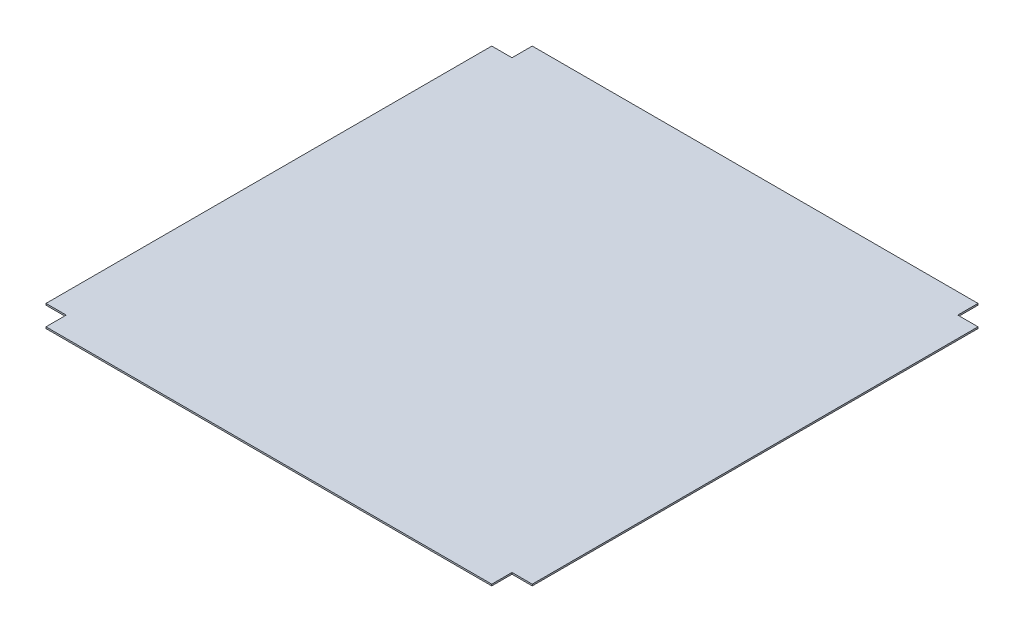
ISO-10303-21;
HEADER;
FILE_DESCRIPTION(('STEP AP214'),'2;1');
FILE_NAME('part.step','',(''),(''),'','','');
FILE_SCHEMA(('AUTOMOTIVE_DESIGN { 1 0 10303 214 1 1 1 1 }'));
ENDSEC;
DATA;
#1=APPLICATION_CONTEXT('core data for automotive mechanical design processes');
#2=APPLICATION_PROTOCOL_DEFINITION('international standard','automotive_design',2000,#1);
#3=PRODUCT_CONTEXT('',#1,'mechanical');
#4=PRODUCT('Part','Part','',(#3));
#5=PRODUCT_RELATED_PRODUCT_CATEGORY('part','',(#4));
#6=PRODUCT_DEFINITION_FORMATION('','',#4);
#7=PRODUCT_DEFINITION_CONTEXT('part definition',#1,'design');
#8=PRODUCT_DEFINITION('design','',#6,#7);
#9=PRODUCT_DEFINITION_SHAPE('','',#8);
#10=(LENGTH_UNIT() NAMED_UNIT(*) SI_UNIT(.MILLI.,.METRE.));
#11=(NAMED_UNIT(*) PLANE_ANGLE_UNIT() SI_UNIT($,.RADIAN.));
#12=(NAMED_UNIT(*) SI_UNIT($,.STERADIAN.) SOLID_ANGLE_UNIT());
#13=UNCERTAINTY_MEASURE_WITH_UNIT(LENGTH_MEASURE(1.E-05),#10,'distance_accuracy_value','');
#14=(GEOMETRIC_REPRESENTATION_CONTEXT(3) GLOBAL_UNCERTAINTY_ASSIGNED_CONTEXT((#13)) GLOBAL_UNIT_ASSIGNED_CONTEXT((#10,
#11,#12)) REPRESENTATION_CONTEXT('',''));
#15=CARTESIAN_POINT('',(0.,0.,0.));
#16=DIRECTION('',(0.,0.,1.));
#17=DIRECTION('',(1.,0.,0.));
#18=AXIS2_PLACEMENT_3D('',#15,#16,#17);
#19=CARTESIAN_POINT('',(609.6,2.,609.6));
#20=DIRECTION('',(-1.,0.,0.));
#21=DIRECTION('',(0.,0.,1.));
#22=AXIS2_PLACEMENT_3D('',#19,#20,#21);
#23=PLANE('',#22);
#24=DIRECTION('',(0.,0.,-1.));
#25=VECTOR('',#24,1.);
#26=CARTESIAN_POINT('',(609.6,2.,609.6));
#27=LINE('',#26,#25);
#28=CARTESIAN_POINT('',(609.600000000001,2.,558.8));
#29=VERTEX_POINT('',#28);
#30=CARTESIAN_POINT('',(609.6,2.,-558.8));
#31=VERTEX_POINT('',#30);
#32=EDGE_CURVE('E156',#29,#31,#27,.T.);
#33=ORIENTED_EDGE('',*,*,#32,.F.);
#34=DIRECTION('',(0.,1.,0.));
#35=VECTOR('',#34,1.);
#36=CARTESIAN_POINT('',(609.600000000001,-2.,558.8));
#37=LINE('',#36,#35);
#38=CARTESIAN_POINT('',(609.600000000001,-2.,558.8));
#39=VERTEX_POINT('',#38);
#40=EDGE_CURVE('E258',#39,#29,#37,.T.);
#41=ORIENTED_EDGE('',*,*,#40,.F.);
#42=DIRECTION('',(0.,0.,-1.));
#43=VECTOR('',#42,1.);
#44=CARTESIAN_POINT('',(609.6,-2.,609.6));
#45=LINE('',#44,#43);
#46=CARTESIAN_POINT('',(609.6,-2.,-558.8));
#47=VERTEX_POINT('',#46);
#48=EDGE_CURVE('E158',#39,#47,#45,.T.);
#49=ORIENTED_EDGE('',*,*,#48,.T.);
#50=DIRECTION('',(0.,1.,0.));
#51=VECTOR('',#50,1.);
#52=CARTESIAN_POINT('',(609.6,-2.,-558.8));
#53=LINE('',#52,#51);
#54=EDGE_CURVE('E140',#47,#31,#53,.T.);
#55=ORIENTED_EDGE('',*,*,#54,.T.);
#56=EDGE_LOOP('',(#33,#41,#49,#55));
#57=FACE_BOUND('',#56,.T.);
#58=ADVANCED_FACE('F47',(#57),#23,.F.);
#59=CARTESIAN_POINT('',(-609.6,2.,-609.6));
#60=DIRECTION('',(0.,0.,1.));
#61=DIRECTION('',(1.,0.,0.));
#62=AXIS2_PLACEMENT_3D('',#59,#60,#61);
#63=PLANE('',#62);
#64=DIRECTION('',(-1.,0.,0.));
#65=VECTOR('',#64,1.);
#66=CARTESIAN_POINT('',(-609.6,2.,-609.6));
#67=LINE('',#66,#65);
#68=CARTESIAN_POINT('',(558.800000000001,2.,-609.6));
#69=VERTEX_POINT('',#68);
#70=CARTESIAN_POINT('',(-558.800000000001,2.,-609.6));
#71=VERTEX_POINT('',#70);
#72=EDGE_CURVE('E168',#69,#71,#67,.T.);
#73=ORIENTED_EDGE('',*,*,#72,.F.);
#74=DIRECTION('',(0.,1.,0.));
#75=VECTOR('',#74,1.);
#76=CARTESIAN_POINT('',(558.800000000001,-2.,-609.6));
#77=LINE('',#76,#75);
#78=CARTESIAN_POINT('',(558.800000000001,-2.,-609.6));
#79=VERTEX_POINT('',#78);
#80=EDGE_CURVE('E248',#79,#69,#77,.T.);
#81=ORIENTED_EDGE('',*,*,#80,.F.);
#82=DIRECTION('',(-1.,0.,0.));
#83=VECTOR('',#82,1.);
#84=CARTESIAN_POINT('',(-609.6,-2.,-609.6));
#85=LINE('',#84,#83);
#86=CARTESIAN_POINT('',(-558.800000000001,-2.,-609.6));
#87=VERTEX_POINT('',#86);
#88=EDGE_CURVE('E184',#79,#87,#85,.T.);
#89=ORIENTED_EDGE('',*,*,#88,.T.);
#90=DIRECTION('',(0.,1.,0.));
#91=VECTOR('',#90,1.);
#92=CARTESIAN_POINT('',(-558.800000000001,-2.,-609.6));
#93=LINE('',#92,#91);
#94=EDGE_CURVE('E185',#87,#71,#93,.T.);
#95=ORIENTED_EDGE('',*,*,#94,.T.);
#96=EDGE_LOOP('',(#73,#81,#89,#95));
#97=FACE_BOUND('',#96,.T.);
#98=ADVANCED_FACE('F245',(#97),#63,.F.);
#99=CARTESIAN_POINT('',(-609.6,2.,609.6));
#100=DIRECTION('',(1.,0.,0.));
#101=DIRECTION('',(0.,0.,-1.));
#102=AXIS2_PLACEMENT_3D('',#99,#100,#101);
#103=PLANE('',#102);
#104=DIRECTION('',(0.,0.,1.));
#105=VECTOR('',#104,1.);
#106=CARTESIAN_POINT('',(-609.6,-2.,609.6));
#107=LINE('',#106,#105);
#108=CARTESIAN_POINT('',(-609.6,-2.,-558.8));
#109=VERTEX_POINT('',#108);
#110=CARTESIAN_POINT('',(-609.6,-2.,558.8));
#111=VERTEX_POINT('',#110);
#112=EDGE_CURVE('E175',#109,#111,#107,.T.);
#113=ORIENTED_EDGE('',*,*,#112,.T.);
#114=DIRECTION('',(0.,1.,0.));
#115=VECTOR('',#114,1.);
#116=CARTESIAN_POINT('',(-609.6,-2.,558.8));
#117=LINE('',#116,#115);
#118=CARTESIAN_POINT('',(-609.6,2.,558.8));
#119=VERTEX_POINT('',#118);
#120=EDGE_CURVE('E196',#111,#119,#117,.T.);
#121=ORIENTED_EDGE('',*,*,#120,.T.);
#122=DIRECTION('',(0.,0.,1.));
#123=VECTOR('',#122,1.);
#124=CARTESIAN_POINT('',(-609.6,2.,609.6));
#125=LINE('',#124,#123);
#126=CARTESIAN_POINT('',(-609.6,2.,-558.8));
#127=VERTEX_POINT('',#126);
#128=EDGE_CURVE('E56',#127,#119,#125,.T.);
#129=ORIENTED_EDGE('',*,*,#128,.F.);
#130=DIRECTION('',(0.,1.,0.));
#131=VECTOR('',#130,1.);
#132=CARTESIAN_POINT('',(-609.6,-2.,-558.8));
#133=LINE('',#132,#131);
#134=EDGE_CURVE('E177',#109,#127,#133,.T.);
#135=ORIENTED_EDGE('',*,*,#134,.F.);
#136=EDGE_LOOP('',(#113,#121,#129,#135));
#137=FACE_BOUND('',#136,.T.);
#138=ADVANCED_FACE('F194',(#137),#103,.F.);
#139=CARTESIAN_POINT('',(-609.6,2.,609.6));
#140=DIRECTION('',(0.,0.,-1.));
#141=DIRECTION('',(-1.,0.,0.));
#142=AXIS2_PLACEMENT_3D('',#139,#140,#141);
#143=PLANE('',#142);
#144=DIRECTION('',(1.,0.,0.));
#145=VECTOR('',#144,1.);
#146=CARTESIAN_POINT('',(-609.6,2.,609.6));
#147=LINE('',#146,#145);
#148=CARTESIAN_POINT('',(-558.8,2.,609.6));
#149=VERTEX_POINT('',#148);
#150=CARTESIAN_POINT('',(558.800000000001,2.,609.6));
#151=VERTEX_POINT('',#150);
#152=EDGE_CURVE('E11',#149,#151,#147,.T.);
#153=ORIENTED_EDGE('',*,*,#152,.F.);
#154=DIRECTION('',(0.,1.,0.));
#155=VECTOR('',#154,1.);
#156=CARTESIAN_POINT('',(-558.8,-2.,609.6));
#157=LINE('',#156,#155);
#158=CARTESIAN_POINT('',(-558.8,-2.,609.6));
#159=VERTEX_POINT('',#158);
#160=EDGE_CURVE('E206',#159,#149,#157,.T.);
#161=ORIENTED_EDGE('',*,*,#160,.F.);
#162=DIRECTION('',(1.,0.,0.));
#163=VECTOR('',#162,1.);
#164=CARTESIAN_POINT('',(-609.6,-2.,609.6));
#165=LINE('',#164,#163);
#166=CARTESIAN_POINT('',(558.800000000001,-2.,609.6));
#167=VERTEX_POINT('',#166);
#168=EDGE_CURVE('E50',#159,#167,#165,.T.);
#169=ORIENTED_EDGE('',*,*,#168,.T.);
#170=DIRECTION('',(0.,1.,0.));
#171=VECTOR('',#170,1.);
#172=CARTESIAN_POINT('',(558.800000000001,-2.,609.6));
#173=LINE('',#172,#171);
#174=EDGE_CURVE('E264',#167,#151,#173,.T.);
#175=ORIENTED_EDGE('',*,*,#174,.T.);
#176=EDGE_LOOP('',(#153,#161,#169,#175));
#177=FACE_BOUND('',#176,.T.);
#178=ADVANCED_FACE('F291',(#177),#143,.F.);
#179=CARTESIAN_POINT('',(0.,2.,0.));
#180=DIRECTION('',(0.,-1.,0.));
#181=DIRECTION('',(0.,0.,-1.));
#182=AXIS2_PLACEMENT_3D('',#179,#180,#181);
#183=PLANE('',#182);
#184=ORIENTED_EDGE('',*,*,#128,.T.);
#185=DIRECTION('',(-1.,0.,0.));
#186=VECTOR('',#185,1.);
#187=CARTESIAN_POINT('',(-609.6,2.,558.8));
#188=LINE('',#187,#186);
#189=CARTESIAN_POINT('',(-558.8,2.,558.8));
#190=VERTEX_POINT('',#189);
#191=EDGE_CURVE('E210',#190,#119,#188,.T.);
#192=ORIENTED_EDGE('',*,*,#191,.F.);
#193=DIRECTION('',(0.,0.,-1.));
#194=VECTOR('',#193,1.);
#195=CARTESIAN_POINT('',(-558.8,2.,609.6));
#196=LINE('',#195,#194);
#197=EDGE_CURVE('E215',#149,#190,#196,.T.);
#198=ORIENTED_EDGE('',*,*,#197,.F.);
#199=ORIENTED_EDGE('',*,*,#152,.T.);
#200=DIRECTION('',(0.,0.,1.));
#201=VECTOR('',#200,1.);
#202=CARTESIAN_POINT('',(558.800000000001,2.,609.6));
#203=LINE('',#202,#201);
#204=CARTESIAN_POINT('',(558.800000000001,2.,558.8));
#205=VERTEX_POINT('',#204);
#206=EDGE_CURVE('E268',#205,#151,#203,.T.);
#207=ORIENTED_EDGE('',*,*,#206,.F.);
#208=DIRECTION('',(-1.,0.,0.));
#209=VECTOR('',#208,1.);
#210=CARTESIAN_POINT('',(609.600000000001,2.,558.8));
#211=LINE('',#210,#209);
#212=EDGE_CURVE('E160',#29,#205,#211,.T.);
#213=ORIENTED_EDGE('',*,*,#212,.F.);
#214=ORIENTED_EDGE('',*,*,#32,.T.);
#215=DIRECTION('',(1.,0.,0.));
#216=VECTOR('',#215,1.);
#217=CARTESIAN_POINT('',(609.6,2.,-558.8));
#218=LINE('',#217,#216);
#219=CARTESIAN_POINT('',(558.800000000001,2.,-558.8));
#220=VERTEX_POINT('',#219);
#221=EDGE_CURVE('E137',#220,#31,#218,.T.);
#222=ORIENTED_EDGE('',*,*,#221,.F.);
#223=DIRECTION('',(0.,0.,1.));
#224=VECTOR('',#223,1.);
#225=CARTESIAN_POINT('',(558.800000000001,2.,-609.6));
#226=LINE('',#225,#224);
#227=EDGE_CURVE('E149',#69,#220,#226,.T.);
#228=ORIENTED_EDGE('',*,*,#227,.F.);
#229=ORIENTED_EDGE('',*,*,#72,.T.);
#230=DIRECTION('',(0.,0.,-1.));
#231=VECTOR('',#230,1.);
#232=CARTESIAN_POINT('',(-558.800000000001,2.,-609.6));
#233=LINE('',#232,#231);
#234=CARTESIAN_POINT('',(-558.800000000001,2.,-558.8));
#235=VERTEX_POINT('',#234);
#236=EDGE_CURVE('E221',#235,#71,#233,.T.);
#237=ORIENTED_EDGE('',*,*,#236,.F.);
#238=DIRECTION('',(1.,0.,0.));
#239=VECTOR('',#238,1.);
#240=CARTESIAN_POINT('',(-609.6,2.,-558.8));
#241=LINE('',#240,#239);
#242=EDGE_CURVE('E224',#127,#235,#241,.T.);
#243=ORIENTED_EDGE('',*,*,#242,.F.);
#244=EDGE_LOOP('',(#184,#192,#198,#199,#207,#213,#214,#222,#228,#229,#237,#243));
#245=FACE_BOUND('',#244,.T.);
#246=ADVANCED_FACE('F164',(#245),#183,.F.);
#247=CARTESIAN_POINT('',(0.,-2.,0.));
#248=DIRECTION('',(0.,-1.,0.));
#249=DIRECTION('',(0.,0.,-1.));
#250=AXIS2_PLACEMENT_3D('',#247,#248,#249);
#251=PLANE('',#250);
#252=DIRECTION('',(-1.,0.,0.));
#253=VECTOR('',#252,1.);
#254=CARTESIAN_POINT('',(-609.6,-2.,558.8));
#255=LINE('',#254,#253);
#256=CARTESIAN_POINT('',(-558.8,-2.,558.8));
#257=VERTEX_POINT('',#256);
#258=EDGE_CURVE('E64',#257,#111,#255,.T.);
#259=ORIENTED_EDGE('',*,*,#258,.T.);
#260=ORIENTED_EDGE('',*,*,#112,.F.);
#261=DIRECTION('',(1.,0.,0.));
#262=VECTOR('',#261,1.);
#263=CARTESIAN_POINT('',(-609.6,-2.,-558.8));
#264=LINE('',#263,#262);
#265=CARTESIAN_POINT('',(-558.800000000001,-2.,-558.8));
#266=VERTEX_POINT('',#265);
#267=EDGE_CURVE('E201',#109,#266,#264,.T.);
#268=ORIENTED_EDGE('',*,*,#267,.T.);
#269=DIRECTION('',(0.,0.,-1.));
#270=VECTOR('',#269,1.);
#271=CARTESIAN_POINT('',(-558.800000000001,-2.,-609.6));
#272=LINE('',#271,#270);
#273=EDGE_CURVE('E220',#266,#87,#272,.T.);
#274=ORIENTED_EDGE('',*,*,#273,.T.);
#275=ORIENTED_EDGE('',*,*,#88,.F.);
#276=DIRECTION('',(0.,0.,1.));
#277=VECTOR('',#276,1.);
#278=CARTESIAN_POINT('',(558.800000000001,-2.,-609.6));
#279=LINE('',#278,#277);
#280=CARTESIAN_POINT('',(558.800000000001,-2.,-558.8));
#281=VERTEX_POINT('',#280);
#282=EDGE_CURVE('E150',#79,#281,#279,.T.);
#283=ORIENTED_EDGE('',*,*,#282,.T.);
#284=DIRECTION('',(1.,0.,0.));
#285=VECTOR('',#284,1.);
#286=CARTESIAN_POINT('',(609.6,-2.,-558.8));
#287=LINE('',#286,#285);
#288=EDGE_CURVE('E250',#281,#47,#287,.T.);
#289=ORIENTED_EDGE('',*,*,#288,.T.);
#290=ORIENTED_EDGE('',*,*,#48,.F.);
#291=DIRECTION('',(-1.,0.,0.));
#292=VECTOR('',#291,1.);
#293=CARTESIAN_POINT('',(609.600000000001,-2.,558.8));
#294=LINE('',#293,#292);
#295=CARTESIAN_POINT('',(558.800000000001,-2.,558.8));
#296=VERTEX_POINT('',#295);
#297=EDGE_CURVE('E271',#39,#296,#294,.T.);
#298=ORIENTED_EDGE('',*,*,#297,.T.);
#299=DIRECTION('',(0.,0.,1.));
#300=VECTOR('',#299,1.);
#301=CARTESIAN_POINT('',(558.800000000001,-2.,609.6));
#302=LINE('',#301,#300);
#303=EDGE_CURVE('E72',#296,#167,#302,.T.);
#304=ORIENTED_EDGE('',*,*,#303,.T.);
#305=ORIENTED_EDGE('',*,*,#168,.F.);
#306=DIRECTION('',(0.,0.,-1.));
#307=VECTOR('',#306,1.);
#308=CARTESIAN_POINT('',(-558.8,-2.,609.6));
#309=LINE('',#308,#307);
#310=EDGE_CURVE('E204',#159,#257,#309,.T.);
#311=ORIENTED_EDGE('',*,*,#310,.T.);
#312=EDGE_LOOP('',(#259,#260,#268,#274,#275,#283,#289,#290,#298,#304,#305,#311));
#313=FACE_BOUND('',#312,.T.);
#314=ADVANCED_FACE('F199',(#313),#251,.T.);
#315=CARTESIAN_POINT('',(-558.800000000001,-2.,-609.6));
#316=DIRECTION('',(1.,0.,0.));
#317=DIRECTION('',(0.,0.,-1.));
#318=AXIS2_PLACEMENT_3D('',#315,#316,#317);
#319=PLANE('',#318);
#320=ORIENTED_EDGE('',*,*,#236,.T.);
#321=ORIENTED_EDGE('',*,*,#94,.F.);
#322=ORIENTED_EDGE('',*,*,#273,.F.);
#323=DIRECTION('',(0.,1.,0.));
#324=VECTOR('',#323,1.);
#325=CARTESIAN_POINT('',(-558.800000000001,-2.,-558.8));
#326=LINE('',#325,#324);
#327=EDGE_CURVE('E232',#266,#235,#326,.T.);
#328=ORIENTED_EDGE('',*,*,#327,.T.);
#329=EDGE_LOOP('',(#320,#321,#322,#328));
#330=FACE_BOUND('',#329,.T.);
#331=ADVANCED_FACE('F243',(#330),#319,.F.);
#332=CARTESIAN_POINT('',(-609.6,-2.,-558.8));
#333=DIRECTION('',(0.,0.,1.));
#334=DIRECTION('',(1.,0.,0.));
#335=AXIS2_PLACEMENT_3D('',#332,#333,#334);
#336=PLANE('',#335);
#337=ORIENTED_EDGE('',*,*,#242,.T.);
#338=ORIENTED_EDGE('',*,*,#327,.F.);
#339=ORIENTED_EDGE('',*,*,#267,.F.);
#340=ORIENTED_EDGE('',*,*,#134,.T.);
#341=EDGE_LOOP('',(#337,#338,#339,#340));
#342=FACE_BOUND('',#341,.T.);
#343=ADVANCED_FACE('F239',(#342),#336,.F.);
#344=CARTESIAN_POINT('',(609.6,-2.,-558.8));
#345=DIRECTION('',(0.,0.,1.));
#346=DIRECTION('',(1.,0.,0.));
#347=AXIS2_PLACEMENT_3D('',#344,#345,#346);
#348=PLANE('',#347);
#349=ORIENTED_EDGE('',*,*,#221,.T.);
#350=ORIENTED_EDGE('',*,*,#54,.F.);
#351=ORIENTED_EDGE('',*,*,#288,.F.);
#352=DIRECTION('',(0.,1.,0.));
#353=VECTOR('',#352,1.);
#354=CARTESIAN_POINT('',(558.800000000001,-2.,-558.8));
#355=LINE('',#354,#353);
#356=EDGE_CURVE('E143',#281,#220,#355,.T.);
#357=ORIENTED_EDGE('',*,*,#356,.T.);
#358=EDGE_LOOP('',(#349,#350,#351,#357));
#359=FACE_BOUND('',#358,.T.);
#360=ADVANCED_FACE('F139',(#359),#348,.F.);
#361=CARTESIAN_POINT('',(558.800000000001,-2.,-609.6));
#362=DIRECTION('',(-1.,0.,0.));
#363=DIRECTION('',(0.,0.,1.));
#364=AXIS2_PLACEMENT_3D('',#361,#362,#363);
#365=PLANE('',#364);
#366=ORIENTED_EDGE('',*,*,#227,.T.);
#367=ORIENTED_EDGE('',*,*,#356,.F.);
#368=ORIENTED_EDGE('',*,*,#282,.F.);
#369=ORIENTED_EDGE('',*,*,#80,.T.);
#370=EDGE_LOOP('',(#366,#367,#368,#369));
#371=FACE_BOUND('',#370,.T.);
#372=ADVANCED_FACE('F303',(#371),#365,.F.);
#373=CARTESIAN_POINT('',(558.800000000001,-2.,609.6));
#374=DIRECTION('',(-1.,0.,0.));
#375=DIRECTION('',(0.,0.,1.));
#376=AXIS2_PLACEMENT_3D('',#373,#374,#375);
#377=PLANE('',#376);
#378=ORIENTED_EDGE('',*,*,#206,.T.);
#379=ORIENTED_EDGE('',*,*,#174,.F.);
#380=ORIENTED_EDGE('',*,*,#303,.F.);
#381=DIRECTION('',(0.,1.,0.));
#382=VECTOR('',#381,1.);
#383=CARTESIAN_POINT('',(558.800000000001,-2.,558.8));
#384=LINE('',#383,#382);
#385=EDGE_CURVE('E261',#296,#205,#384,.T.);
#386=ORIENTED_EDGE('',*,*,#385,.T.);
#387=EDGE_LOOP('',(#378,#379,#380,#386));
#388=FACE_BOUND('',#387,.T.);
#389=ADVANCED_FACE('F292',(#388),#377,.F.);
#390=CARTESIAN_POINT('',(609.600000000001,-2.,558.8));
#391=DIRECTION('',(0.,0.,-1.));
#392=DIRECTION('',(-1.,0.,0.));
#393=AXIS2_PLACEMENT_3D('',#390,#391,#392);
#394=PLANE('',#393);
#395=ORIENTED_EDGE('',*,*,#212,.T.);
#396=ORIENTED_EDGE('',*,*,#385,.F.);
#397=ORIENTED_EDGE('',*,*,#297,.F.);
#398=ORIENTED_EDGE('',*,*,#40,.T.);
#399=EDGE_LOOP('',(#395,#396,#397,#398));
#400=FACE_BOUND('',#399,.T.);
#401=ADVANCED_FACE('F294',(#400),#394,.F.);
#402=CARTESIAN_POINT('',(-609.6,-2.,558.8));
#403=DIRECTION('',(0.,0.,-1.));
#404=DIRECTION('',(-1.,0.,0.));
#405=AXIS2_PLACEMENT_3D('',#402,#403,#404);
#406=PLANE('',#405);
#407=ORIENTED_EDGE('',*,*,#191,.T.);
#408=ORIENTED_EDGE('',*,*,#120,.F.);
#409=ORIENTED_EDGE('',*,*,#258,.F.);
#410=DIRECTION('',(0.,1.,0.));
#411=VECTOR('',#410,1.);
#412=CARTESIAN_POINT('',(-558.8,-2.,558.8));
#413=LINE('',#412,#411);
#414=EDGE_CURVE('E212',#257,#190,#413,.T.);
#415=ORIENTED_EDGE('',*,*,#414,.T.);
#416=EDGE_LOOP('',(#407,#408,#409,#415));
#417=FACE_BOUND('',#416,.T.);
#418=ADVANCED_FACE('F296',(#417),#406,.F.);
#419=CARTESIAN_POINT('',(-558.8,-2.,609.6));
#420=DIRECTION('',(1.,0.,0.));
#421=DIRECTION('',(0.,0.,-1.));
#422=AXIS2_PLACEMENT_3D('',#419,#420,#421);
#423=PLANE('',#422);
#424=ORIENTED_EDGE('',*,*,#197,.T.);
#425=ORIENTED_EDGE('',*,*,#414,.F.);
#426=ORIENTED_EDGE('',*,*,#310,.F.);
#427=ORIENTED_EDGE('',*,*,#160,.T.);
#428=EDGE_LOOP('',(#424,#425,#426,#427));
#429=FACE_BOUND('',#428,.T.);
#430=ADVANCED_FACE('F287',(#429),#423,.F.);
#431=CLOSED_SHELL('',(#58,#98,#138,#178,#246,#314,#331,#343,#360,#372,#389,#401,#418,#430));
#432=MANIFOLD_SOLID_BREP('B2',#431);
#433=ADVANCED_BREP_SHAPE_REPRESENTATION('',(#18,#432),#14);
#434=SHAPE_DEFINITION_REPRESENTATION(#9,#433);
ENDSEC;
END-ISO-10303-21;
